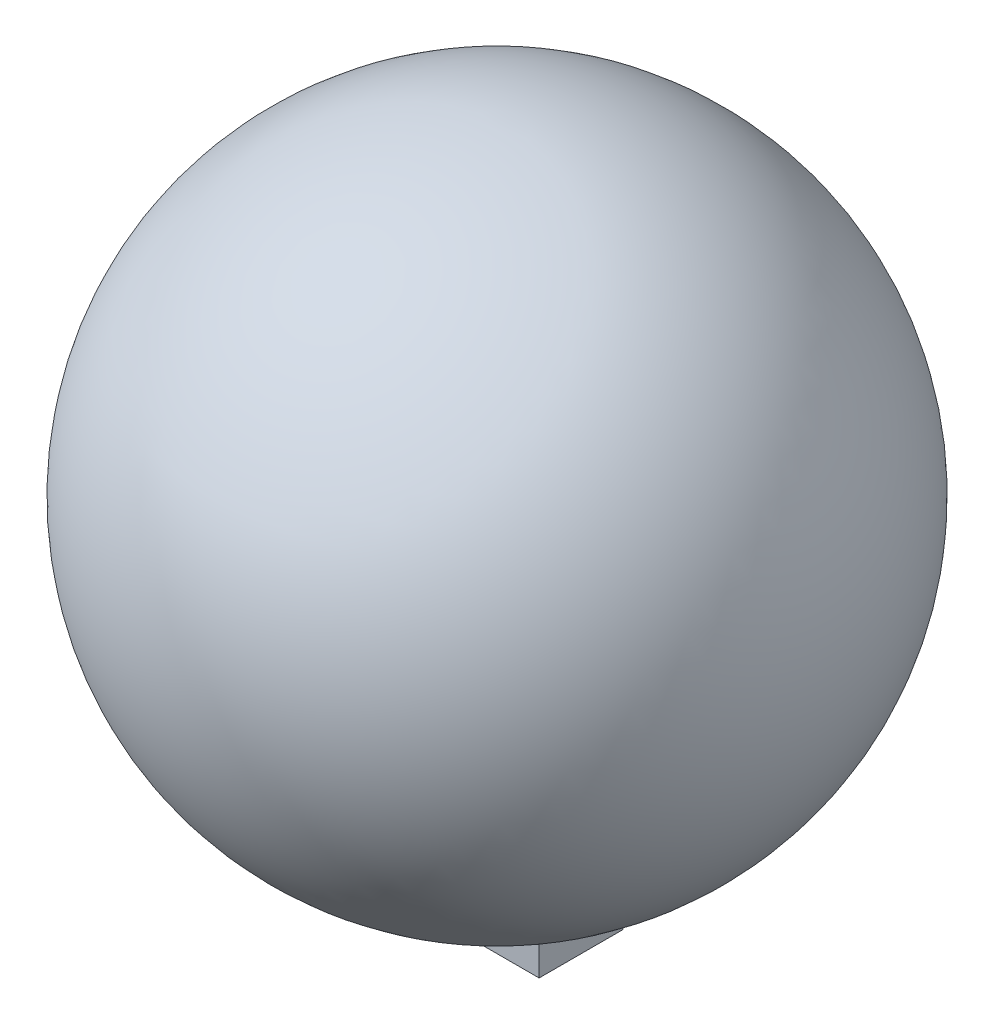
ISO-10303-21;
HEADER;
FILE_DESCRIPTION(('STEP AP214'),'2;1');
FILE_NAME('part.step','',(''),(''),'','','');
FILE_SCHEMA(('AUTOMOTIVE_DESIGN { 1 0 10303 214 1 1 1 1 }'));
ENDSEC;
DATA;
#1=APPLICATION_CONTEXT('core data for automotive mechanical design processes');
#2=APPLICATION_PROTOCOL_DEFINITION('international standard','automotive_design',2000,#1);
#3=PRODUCT_CONTEXT('',#1,'mechanical');
#4=PRODUCT('Part','Part','',(#3));
#5=PRODUCT_RELATED_PRODUCT_CATEGORY('part','',(#4));
#6=PRODUCT_DEFINITION_FORMATION('','',#4);
#7=PRODUCT_DEFINITION_CONTEXT('part definition',#1,'design');
#8=PRODUCT_DEFINITION('design','',#6,#7);
#9=PRODUCT_DEFINITION_SHAPE('','',#8);
#10=(LENGTH_UNIT() NAMED_UNIT(*) SI_UNIT(.MILLI.,.METRE.));
#11=(NAMED_UNIT(*) PLANE_ANGLE_UNIT() SI_UNIT($,.RADIAN.));
#12=(NAMED_UNIT(*) SI_UNIT($,.STERADIAN.) SOLID_ANGLE_UNIT());
#13=UNCERTAINTY_MEASURE_WITH_UNIT(LENGTH_MEASURE(1.E-05),#10,'distance_accuracy_value','');
#14=(GEOMETRIC_REPRESENTATION_CONTEXT(3) GLOBAL_UNCERTAINTY_ASSIGNED_CONTEXT((#13)) GLOBAL_UNIT_ASSIGNED_CONTEXT((#10,
#11,#12)) REPRESENTATION_CONTEXT('',''));
#15=CARTESIAN_POINT('',(0.,0.,0.));
#16=DIRECTION('',(0.,0.,1.));
#17=DIRECTION('',(1.,0.,0.));
#18=AXIS2_PLACEMENT_3D('',#15,#16,#17);
#19=CARTESIAN_POINT('',(0.,0.,0.));
#20=DIRECTION('',(0.,1.,0.));
#21=DIRECTION('',(0.,0.,1.));
#22=AXIS2_PLACEMENT_3D('',#19,#20,#21);
#23=PLANE('',#22);
#24=DIRECTION('',(0.,0.,-1.));
#25=VECTOR('',#24,1.);
#26=CARTESIAN_POINT('',(7.00000000000001,0.,5.));
#27=LINE('',#26,#25);
#28=CARTESIAN_POINT('',(7.00000000000001,0.,5.));
#29=VERTEX_POINT('',#28);
#30=CARTESIAN_POINT('',(7.00000000000001,0.,-5.));
#31=VERTEX_POINT('',#30);
#32=EDGE_CURVE('E59',#29,#31,#27,.T.);
#33=ORIENTED_EDGE('',*,*,#32,.F.);
#34=DIRECTION('',(-1.,0.,0.));
#35=VECTOR('',#34,1.);
#36=CARTESIAN_POINT('',(-10.,0.,5.));
#37=LINE('',#36,#35);
#38=CARTESIAN_POINT('',(10.,0.,5.));
#39=VERTEX_POINT('',#38);
#40=EDGE_CURVE('E104',#39,#29,#37,.T.);
#41=ORIENTED_EDGE('',*,*,#40,.F.);
#42=DIRECTION('',(0.,0.,1.));
#43=VECTOR('',#42,1.);
#44=CARTESIAN_POINT('',(10.,0.,5.));
#45=LINE('',#44,#43);
#46=CARTESIAN_POINT('',(10.,0.,-5.));
#47=VERTEX_POINT('',#46);
#48=EDGE_CURVE('E125',#47,#39,#45,.T.);
#49=ORIENTED_EDGE('',*,*,#48,.F.);
#50=DIRECTION('',(1.,0.,0.));
#51=VECTOR('',#50,1.);
#52=CARTESIAN_POINT('',(-9.99999999999999,0.,-5.));
#53=LINE('',#52,#51);
#54=EDGE_CURVE('E106',#31,#47,#53,.T.);
#55=ORIENTED_EDGE('',*,*,#54,.F.);
#56=EDGE_LOOP('',(#33,#41,#49,#55));
#57=FACE_BOUND('',#56,.T.);
#58=CARTESIAN_POINT('',(0.,0.,0.));
#59=DIRECTION('',(0.,-1.,0.));
#60=DIRECTION('',(0.,0.,-1.));
#61=AXIS2_PLACEMENT_3D('',#58,#59,#60);
#62=CIRCLE('',#61,20.);
#63=CARTESIAN_POINT('',(0.,0.,-20.));
#64=VERTEX_POINT('',#63);
#65=EDGE_CURVE('E11',#64,#64,#62,.T.);
#66=ORIENTED_EDGE('',*,*,#65,.T.);
#67=EDGE_LOOP('',(#66));
#68=FACE_BOUND('',#67,.T.);
#69=CARTESIAN_POINT('',(-6.99999999999999,0.,5.));
#70=VERTEX_POINT('',#69);
#71=CARTESIAN_POINT('',(-10.,0.,5.));
#72=VERTEX_POINT('',#71);
#73=EDGE_CURVE('E121',#70,#72,#37,.T.);
#74=ORIENTED_EDGE('',*,*,#73,.F.);
#75=DIRECTION('',(0.,0.,-1.));
#76=VECTOR('',#75,1.);
#77=CARTESIAN_POINT('',(-6.99999999999999,0.,5.));
#78=LINE('',#77,#76);
#79=CARTESIAN_POINT('',(-6.99999999999999,0.,-5.));
#80=VERTEX_POINT('',#79);
#81=EDGE_CURVE('E171',#70,#80,#78,.T.);
#82=ORIENTED_EDGE('',*,*,#81,.T.);
#83=CARTESIAN_POINT('',(-9.99999999999999,0.,-5.));
#84=VERTEX_POINT('',#83);
#85=EDGE_CURVE('E129',#84,#80,#53,.T.);
#86=ORIENTED_EDGE('',*,*,#85,.F.);
#87=DIRECTION('',(0.,0.,-1.));
#88=VECTOR('',#87,1.);
#89=CARTESIAN_POINT('',(-10.,0.,5.));
#90=LINE('',#89,#88);
#91=EDGE_CURVE('E120',#72,#84,#90,.T.);
#92=ORIENTED_EDGE('',*,*,#91,.F.);
#93=EDGE_LOOP('',(#74,#82,#86,#92));
#94=FACE_BOUND('',#93,.T.);
#95=ADVANCED_FACE('F36',(#57,#68,#94),#23,.F.);
#96=CARTESIAN_POINT('',(0.,32.1428571428571,0.));
#97=DIRECTION('',(0.,-1.,0.));
#98=DIRECTION('',(-1.,0.,0.));
#99=AXIS2_PLACEMENT_3D('',#96,#97,#98);
#100=SPHERICAL_SURFACE('',#99,37.8571428571429);
#101=ORIENTED_EDGE('',*,*,#65,.F.);
#102=EDGE_LOOP('',(#101));
#103=FACE_BOUND('',#102,.T.);
#104=ADVANCED_FACE('F159',(#103),#100,.T.);
#105=CARTESIAN_POINT('',(10.,-10.,5.));
#106=DIRECTION('',(-1.,0.,0.));
#107=DIRECTION('',(0.,0.,1.));
#108=AXIS2_PLACEMENT_3D('',#105,#106,#107);
#109=PLANE('',#108);
#110=ORIENTED_EDGE('',*,*,#48,.T.);
#111=DIRECTION('',(0.,1.,0.));
#112=VECTOR('',#111,1.);
#113=CARTESIAN_POINT('',(10.,-10.,5.));
#114=LINE('',#113,#112);
#115=CARTESIAN_POINT('',(10.,-10.,5.));
#116=VERTEX_POINT('',#115);
#117=EDGE_CURVE('E118',#116,#39,#114,.T.);
#118=ORIENTED_EDGE('',*,*,#117,.F.);
#119=DIRECTION('',(0.,0.,1.));
#120=VECTOR('',#119,1.);
#121=CARTESIAN_POINT('',(10.,-10.,5.));
#122=LINE('',#121,#120);
#123=CARTESIAN_POINT('',(10.,-10.,-5.));
#124=VERTEX_POINT('',#123);
#125=EDGE_CURVE('E132',#124,#116,#122,.T.);
#126=ORIENTED_EDGE('',*,*,#125,.F.);
#127=DIRECTION('',(0.,1.,0.));
#128=VECTOR('',#127,1.);
#129=CARTESIAN_POINT('',(10.,-10.,-5.));
#130=LINE('',#129,#128);
#131=EDGE_CURVE('E133',#124,#47,#130,.T.);
#132=ORIENTED_EDGE('',*,*,#131,.T.);
#133=EDGE_LOOP('',(#110,#118,#126,#132));
#134=FACE_BOUND('',#133,.T.);
#135=ADVANCED_FACE('F157',(#134),#109,.F.);
#136=CARTESIAN_POINT('',(-10.,-10.,5.));
#137=DIRECTION('',(0.,0.,-1.));
#138=DIRECTION('',(-1.,0.,0.));
#139=AXIS2_PLACEMENT_3D('',#136,#137,#138);
#140=PLANE('',#139);
#141=DIRECTION('',(-1.,0.,0.));
#142=VECTOR('',#141,1.);
#143=CARTESIAN_POINT('',(7.00000000000001,-7.,5.));
#144=LINE('',#143,#142);
#145=CARTESIAN_POINT('',(7.,-7.,5.));
#146=VERTEX_POINT('',#145);
#147=CARTESIAN_POINT('',(-6.99999999999999,-7.,5.));
#148=VERTEX_POINT('',#147);
#149=EDGE_CURVE('E51',#146,#148,#144,.T.);
#150=ORIENTED_EDGE('',*,*,#149,.T.);
#151=DIRECTION('',(0.,1.,0.));
#152=VECTOR('',#151,1.);
#153=CARTESIAN_POINT('',(-6.99999999999999,-7.,5.));
#154=LINE('',#153,#152);
#155=EDGE_CURVE('E108',#148,#70,#154,.T.);
#156=ORIENTED_EDGE('',*,*,#155,.T.);
#157=ORIENTED_EDGE('',*,*,#73,.T.);
#158=DIRECTION('',(0.,1.,0.));
#159=VECTOR('',#158,1.);
#160=CARTESIAN_POINT('',(-10.,-10.,5.));
#161=LINE('',#160,#159);
#162=CARTESIAN_POINT('',(-10.,-10.,5.));
#163=VERTEX_POINT('',#162);
#164=EDGE_CURVE('E140',#163,#72,#161,.T.);
#165=ORIENTED_EDGE('',*,*,#164,.F.);
#166=DIRECTION('',(-1.,0.,0.));
#167=VECTOR('',#166,1.);
#168=CARTESIAN_POINT('',(-10.,-10.,5.));
#169=LINE('',#168,#167);
#170=EDGE_CURVE('E193',#116,#163,#169,.T.);
#171=ORIENTED_EDGE('',*,*,#170,.F.);
#172=ORIENTED_EDGE('',*,*,#117,.T.);
#173=ORIENTED_EDGE('',*,*,#40,.T.);
#174=DIRECTION('',(0.,-1.,0.));
#175=VECTOR('',#174,1.);
#176=CARTESIAN_POINT('',(7.00000000000001,-3.,5.));
#177=LINE('',#176,#175);
#178=EDGE_CURVE('E111',#29,#146,#177,.T.);
#179=ORIENTED_EDGE('',*,*,#178,.T.);
#180=EDGE_LOOP('',(#150,#156,#157,#165,#171,#172,#173,#179));
#181=FACE_BOUND('',#180,.T.);
#182=ADVANCED_FACE('F116',(#181),#140,.F.);
#183=CARTESIAN_POINT('',(-10.,-10.,5.));
#184=DIRECTION('',(1.,0.,0.));
#185=DIRECTION('',(0.,0.,-1.));
#186=AXIS2_PLACEMENT_3D('',#183,#184,#185);
#187=PLANE('',#186);
#188=ORIENTED_EDGE('',*,*,#91,.T.);
#189=DIRECTION('',(0.,1.,0.));
#190=VECTOR('',#189,1.);
#191=CARTESIAN_POINT('',(-9.99999999999999,-10.,-5.));
#192=LINE('',#191,#190);
#193=CARTESIAN_POINT('',(-9.99999999999999,-10.,-5.));
#194=VERTEX_POINT('',#193);
#195=EDGE_CURVE('E136',#194,#84,#192,.T.);
#196=ORIENTED_EDGE('',*,*,#195,.F.);
#197=DIRECTION('',(0.,0.,-1.));
#198=VECTOR('',#197,1.);
#199=CARTESIAN_POINT('',(-10.,-10.,5.));
#200=LINE('',#199,#198);
#201=EDGE_CURVE('E195',#163,#194,#200,.T.);
#202=ORIENTED_EDGE('',*,*,#201,.F.);
#203=ORIENTED_EDGE('',*,*,#164,.T.);
#204=EDGE_LOOP('',(#188,#196,#202,#203));
#205=FACE_BOUND('',#204,.T.);
#206=ADVANCED_FACE('F209',(#205),#187,.F.);
#207=CARTESIAN_POINT('',(-9.99999999999999,-10.,-5.));
#208=DIRECTION('',(0.,0.,1.));
#209=DIRECTION('',(1.,0.,0.));
#210=AXIS2_PLACEMENT_3D('',#207,#208,#209);
#211=PLANE('',#210);
#212=ORIENTED_EDGE('',*,*,#85,.T.);
#213=DIRECTION('',(0.,1.,0.));
#214=VECTOR('',#213,1.);
#215=CARTESIAN_POINT('',(-6.99999999999999,-3.,-5.));
#216=LINE('',#215,#214);
#217=CARTESIAN_POINT('',(-6.99999999999999,-7.,-5.));
#218=VERTEX_POINT('',#217);
#219=EDGE_CURVE('E114',#218,#80,#216,.T.);
#220=ORIENTED_EDGE('',*,*,#219,.F.);
#221=DIRECTION('',(-1.,0.,0.));
#222=VECTOR('',#221,1.);
#223=CARTESIAN_POINT('',(7.00000000000001,-7.,-5.));
#224=LINE('',#223,#222);
#225=CARTESIAN_POINT('',(7.00000000000001,-7.,-5.));
#226=VERTEX_POINT('',#225);
#227=EDGE_CURVE('E183',#226,#218,#224,.T.);
#228=ORIENTED_EDGE('',*,*,#227,.F.);
#229=DIRECTION('',(0.,-1.,0.));
#230=VECTOR('',#229,1.);
#231=CARTESIAN_POINT('',(7.00000000000001,-3.,-5.));
#232=LINE('',#231,#230);
#233=EDGE_CURVE('E181',#31,#226,#232,.T.);
#234=ORIENTED_EDGE('',*,*,#233,.F.);
#235=ORIENTED_EDGE('',*,*,#54,.T.);
#236=ORIENTED_EDGE('',*,*,#131,.F.);
#237=DIRECTION('',(1.,0.,0.));
#238=VECTOR('',#237,1.);
#239=CARTESIAN_POINT('',(-9.99999999999999,-10.,-5.));
#240=LINE('',#239,#238);
#241=EDGE_CURVE('E137',#194,#124,#240,.T.);
#242=ORIENTED_EDGE('',*,*,#241,.F.);
#243=ORIENTED_EDGE('',*,*,#195,.T.);
#244=EDGE_LOOP('',(#212,#220,#228,#234,#235,#236,#242,#243));
#245=FACE_BOUND('',#244,.T.);
#246=ADVANCED_FACE('F203',(#245),#211,.F.);
#247=CARTESIAN_POINT('',(0.,-10.,0.));
#248=DIRECTION('',(0.,-1.,0.));
#249=DIRECTION('',(0.,0.,-1.));
#250=AXIS2_PLACEMENT_3D('',#247,#248,#249);
#251=PLANE('',#250);
#252=ORIENTED_EDGE('',*,*,#125,.T.);
#253=ORIENTED_EDGE('',*,*,#170,.T.);
#254=ORIENTED_EDGE('',*,*,#201,.T.);
#255=ORIENTED_EDGE('',*,*,#241,.T.);
#256=EDGE_LOOP('',(#252,#253,#254,#255));
#257=FACE_BOUND('',#256,.T.);
#258=ADVANCED_FACE('F199',(#257),#251,.T.);
#259=CARTESIAN_POINT('',(-6.99999999999999,-3.,5.));
#260=DIRECTION('',(-1.,0.,0.));
#261=DIRECTION('',(0.,0.,1.));
#262=AXIS2_PLACEMENT_3D('',#259,#260,#261);
#263=PLANE('',#262);
#264=ORIENTED_EDGE('',*,*,#219,.T.);
#265=ORIENTED_EDGE('',*,*,#81,.F.);
#266=ORIENTED_EDGE('',*,*,#155,.F.);
#267=DIRECTION('',(0.,0.,-1.));
#268=VECTOR('',#267,1.);
#269=CARTESIAN_POINT('',(-6.99999999999999,-7.,5.));
#270=LINE('',#269,#268);
#271=EDGE_CURVE('E188',#148,#218,#270,.T.);
#272=ORIENTED_EDGE('',*,*,#271,.T.);
#273=EDGE_LOOP('',(#264,#265,#266,#272));
#274=FACE_BOUND('',#273,.T.);
#275=ADVANCED_FACE('F207',(#274),#263,.F.);
#276=CARTESIAN_POINT('',(7.00000000000001,-7.,5.));
#277=DIRECTION('',(0.,-1.,0.));
#278=DIRECTION('',(0.,0.,-1.));
#279=AXIS2_PLACEMENT_3D('',#276,#277,#278);
#280=PLANE('',#279);
#281=ORIENTED_EDGE('',*,*,#227,.T.);
#282=ORIENTED_EDGE('',*,*,#271,.F.);
#283=ORIENTED_EDGE('',*,*,#149,.F.);
#284=DIRECTION('',(0.,0.,-1.));
#285=VECTOR('',#284,1.);
#286=CARTESIAN_POINT('',(7.00000000000001,-7.,5.));
#287=LINE('',#286,#285);
#288=EDGE_CURVE('E107',#146,#226,#287,.T.);
#289=ORIENTED_EDGE('',*,*,#288,.T.);
#290=EDGE_LOOP('',(#281,#282,#283,#289));
#291=FACE_BOUND('',#290,.T.);
#292=ADVANCED_FACE('F206',(#291),#280,.F.);
#293=CARTESIAN_POINT('',(7.00000000000001,-3.,5.));
#294=DIRECTION('',(1.,0.,0.));
#295=DIRECTION('',(0.,0.,-1.));
#296=AXIS2_PLACEMENT_3D('',#293,#294,#295);
#297=PLANE('',#296);
#298=ORIENTED_EDGE('',*,*,#233,.T.);
#299=ORIENTED_EDGE('',*,*,#288,.F.);
#300=ORIENTED_EDGE('',*,*,#178,.F.);
#301=ORIENTED_EDGE('',*,*,#32,.T.);
#302=EDGE_LOOP('',(#298,#299,#300,#301));
#303=FACE_BOUND('',#302,.T.);
#304=ADVANCED_FACE('F112',(#303),#297,.F.);
#305=CLOSED_SHELL('',(#95,#104,#135,#182,#206,#246,#258,#275,#292,#304));
#306=CARTESIAN_POINT('',(0.,32.1428571428571,0.));
#307=DIRECTION('',(0.,-1.,0.));
#308=DIRECTION('',(-1.,0.,0.));
#309=AXIS2_PLACEMENT_3D('',#306,#307,#308);
#310=SPHERICAL_SURFACE('',#309,34.8571428571429);
#311=CARTESIAN_POINT('',(0.,3.,0.));
#312=DIRECTION('',(0.,-1.,0.));
#313=DIRECTION('',(0.,0.,-1.));
#314=AXIS2_PLACEMENT_3D('',#311,#312,#313);
#315=CIRCLE('',#314,19.1236577493503);
#316=CARTESIAN_POINT('',(0.,3.,-19.1236577493503));
#317=VERTEX_POINT('',#316);
#318=EDGE_CURVE('E44',#317,#317,#315,.T.);
#319=ORIENTED_EDGE('',*,*,#318,.T.);
#320=EDGE_LOOP('',(#319));
#321=FACE_BOUND('',#320,.T.);
#322=ADVANCED_FACE('F146',(#321),#310,.F.);
#323=CARTESIAN_POINT('',(0.,3.,0.));
#324=DIRECTION('',(0.,-1.,0.));
#325=DIRECTION('',(0.,0.,-1.));
#326=AXIS2_PLACEMENT_3D('',#323,#324,#325);
#327=PLANE('',#326);
#328=ORIENTED_EDGE('',*,*,#318,.F.);
#329=EDGE_LOOP('',(#328));
#330=FACE_BOUND('',#329,.T.);
#331=ADVANCED_FACE('F148',(#330),#327,.F.);
#332=CLOSED_SHELL('',(#322,#331));
#333=ORIENTED_CLOSED_SHELL('',*,#332,.T.);
#334=BREP_WITH_VOIDS('B2',#305,(#333));
#335=ADVANCED_BREP_SHAPE_REPRESENTATION('',(#18,#334),#14);
#336=SHAPE_DEFINITION_REPRESENTATION(#9,#335);
ENDSEC;
END-ISO-10303-21;
